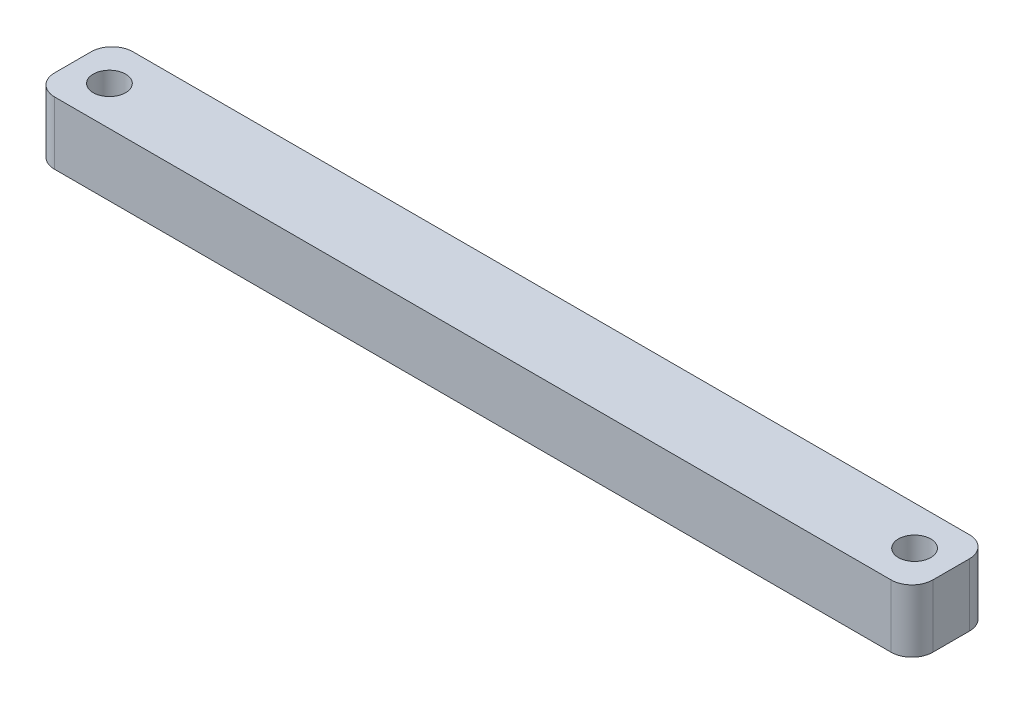
ISO-10303-21;
HEADER;
FILE_DESCRIPTION(('STEP AP214'),'2;1');
FILE_NAME('part.step','',(''),(''),'','','');
FILE_SCHEMA(('AUTOMOTIVE_DESIGN { 1 0 10303 214 1 1 1 1 }'));
ENDSEC;
DATA;
#1=APPLICATION_CONTEXT('core data for automotive mechanical design processes');
#2=APPLICATION_PROTOCOL_DEFINITION('international standard','automotive_design',2000,#1);
#3=PRODUCT_CONTEXT('',#1,'mechanical');
#4=PRODUCT('Part','Part','',(#3));
#5=PRODUCT_RELATED_PRODUCT_CATEGORY('part','',(#4));
#6=PRODUCT_DEFINITION_FORMATION('','',#4);
#7=PRODUCT_DEFINITION_CONTEXT('part definition',#1,'design');
#8=PRODUCT_DEFINITION('design','',#6,#7);
#9=PRODUCT_DEFINITION_SHAPE('','',#8);
#10=(LENGTH_UNIT() NAMED_UNIT(*) SI_UNIT(.MILLI.,.METRE.));
#11=(NAMED_UNIT(*) PLANE_ANGLE_UNIT() SI_UNIT($,.RADIAN.));
#12=(NAMED_UNIT(*) SI_UNIT($,.STERADIAN.) SOLID_ANGLE_UNIT());
#13=UNCERTAINTY_MEASURE_WITH_UNIT(LENGTH_MEASURE(1.E-05),#10,'distance_accuracy_value','');
#14=(GEOMETRIC_REPRESENTATION_CONTEXT(3) GLOBAL_UNCERTAINTY_ASSIGNED_CONTEXT((#13)) GLOBAL_UNIT_ASSIGNED_CONTEXT((#10,
#11,#12)) REPRESENTATION_CONTEXT('',''));
#15=CARTESIAN_POINT('',(0.,0.,0.));
#16=DIRECTION('',(0.,0.,1.));
#17=DIRECTION('',(1.,0.,0.));
#18=AXIS2_PLACEMENT_3D('',#15,#16,#17);
#19=CARTESIAN_POINT('',(0.,6.,0.));
#20=DIRECTION('',(0.,-1.,0.));
#21=DIRECTION('',(0.,0.,-1.));
#22=AXIS2_PLACEMENT_3D('',#19,#20,#21);
#23=PLANE('',#22);
#24=DIRECTION('',(0.,0.,-1.));
#25=VECTOR('',#24,1.);
#26=CARTESIAN_POINT('',(42.045,6.,3.75));
#27=LINE('',#26,#25);
#28=CARTESIAN_POINT('',(42.045,6.,1.75));
#29=VERTEX_POINT('',#28);
#30=CARTESIAN_POINT('',(42.045,6.,-1.75));
#31=VERTEX_POINT('',#30);
#32=EDGE_CURVE('E138',#29,#31,#27,.T.);
#33=ORIENTED_EDGE('',*,*,#32,.T.);
#34=CARTESIAN_POINT('',(40.045,6.,-1.75));
#35=DIRECTION('',(0.,-1.,0.));
#36=DIRECTION('',(0.,0.,-1.));
#37=AXIS2_PLACEMENT_3D('',#34,#35,#36);
#38=CIRCLE('',#37,2.);
#39=CARTESIAN_POINT('',(40.045,6.,-3.75));
#40=VERTEX_POINT('',#39);
#41=EDGE_CURVE('E152',#31,#40,#38,.F.);
#42=ORIENTED_EDGE('',*,*,#41,.T.);
#43=DIRECTION('',(-1.,0.,0.));
#44=VECTOR('',#43,1.);
#45=CARTESIAN_POINT('',(-42.045,6.,-3.75));
#46=LINE('',#45,#44);
#47=CARTESIAN_POINT('',(-40.045,6.,-3.75));
#48=VERTEX_POINT('',#47);
#49=EDGE_CURVE('E119',#40,#48,#46,.T.);
#50=ORIENTED_EDGE('',*,*,#49,.T.);
#51=CARTESIAN_POINT('',(-40.045,6.,-1.75));
#52=DIRECTION('',(0.,-1.,0.));
#53=DIRECTION('',(0.,0.,-1.));
#54=AXIS2_PLACEMENT_3D('',#51,#52,#53);
#55=CIRCLE('',#54,2.);
#56=CARTESIAN_POINT('',(-42.045,6.,-1.75));
#57=VERTEX_POINT('',#56);
#58=EDGE_CURVE('E148',#48,#57,#55,.F.);
#59=ORIENTED_EDGE('',*,*,#58,.T.);
#60=DIRECTION('',(0.,0.,1.));
#61=VECTOR('',#60,1.);
#62=CARTESIAN_POINT('',(-42.045,6.,3.75));
#63=LINE('',#62,#61);
#64=CARTESIAN_POINT('',(-42.045,6.,1.75));
#65=VERTEX_POINT('',#64);
#66=EDGE_CURVE('E161',#57,#65,#63,.T.);
#67=ORIENTED_EDGE('',*,*,#66,.T.);
#68=CARTESIAN_POINT('',(-40.045,6.,1.75));
#69=DIRECTION('',(0.,-1.,0.));
#70=DIRECTION('',(0.,0.,-1.));
#71=AXIS2_PLACEMENT_3D('',#68,#69,#70);
#72=CIRCLE('',#71,2.);
#73=CARTESIAN_POINT('',(-40.045,6.,3.75));
#74=VERTEX_POINT('',#73);
#75=EDGE_CURVE('E54',#65,#74,#72,.F.);
#76=ORIENTED_EDGE('',*,*,#75,.T.);
#77=DIRECTION('',(1.,0.,0.));
#78=VECTOR('',#77,1.);
#79=CARTESIAN_POINT('',(-42.045,6.,3.75));
#80=LINE('',#79,#78);
#81=CARTESIAN_POINT('',(40.045,6.,3.75));
#82=VERTEX_POINT('',#81);
#83=EDGE_CURVE('E139',#74,#82,#80,.T.);
#84=ORIENTED_EDGE('',*,*,#83,.T.);
#85=CARTESIAN_POINT('',(40.045,6.,1.75));
#86=DIRECTION('',(0.,-1.,0.));
#87=DIRECTION('',(0.,0.,-1.));
#88=AXIS2_PLACEMENT_3D('',#85,#86,#87);
#89=CIRCLE('',#88,2.);
#90=EDGE_CURVE('E150',#82,#29,#89,.F.);
#91=ORIENTED_EDGE('',*,*,#90,.T.);
#92=EDGE_LOOP('',(#33,#42,#50,#59,#67,#76,#84,#91));
#93=FACE_BOUND('',#92,.T.);
#94=CARTESIAN_POINT('',(-38.545,6.,0.));
#95=DIRECTION('',(0.,1.,0.));
#96=DIRECTION('',(0.,0.,1.));
#97=AXIS2_PLACEMENT_3D('',#94,#95,#96);
#98=CIRCLE('',#97,1.55);
#99=CARTESIAN_POINT('',(-38.545,6.,1.55));
#100=VERTEX_POINT('',#99);
#101=EDGE_CURVE('E133',#100,#100,#98,.T.);
#102=ORIENTED_EDGE('',*,*,#101,.F.);
#103=EDGE_LOOP('',(#102));
#104=FACE_BOUND('',#103,.T.);
#105=CARTESIAN_POINT('',(38.545,6.,0.));
#106=DIRECTION('',(0.,1.,0.));
#107=DIRECTION('',(0.,0.,-1.));
#108=AXIS2_PLACEMENT_3D('',#105,#106,#107);
#109=CIRCLE('',#108,1.55);
#110=CARTESIAN_POINT('',(38.545,6.,-1.55000000000001));
#111=VERTEX_POINT('',#110);
#112=EDGE_CURVE('E184',#111,#111,#109,.T.);
#113=ORIENTED_EDGE('',*,*,#112,.F.);
#114=EDGE_LOOP('',(#113));
#115=FACE_BOUND('',#114,.T.);
#116=ADVANCED_FACE('F32',(#93,#104,#115),#23,.F.);
#117=CARTESIAN_POINT('',(0.,0.,0.));
#118=DIRECTION('',(0.,-1.,0.));
#119=DIRECTION('',(0.,0.,-1.));
#120=AXIS2_PLACEMENT_3D('',#117,#118,#119);
#121=PLANE('',#120);
#122=CARTESIAN_POINT('',(-38.545,0.,0.));
#123=DIRECTION('',(0.,1.,0.));
#124=DIRECTION('',(0.,0.,1.));
#125=AXIS2_PLACEMENT_3D('',#122,#123,#124);
#126=CIRCLE('',#125,1.55);
#127=CARTESIAN_POINT('',(-38.545,0.,1.55));
#128=VERTEX_POINT('',#127);
#129=EDGE_CURVE('E181',#128,#128,#126,.T.);
#130=ORIENTED_EDGE('',*,*,#129,.T.);
#131=EDGE_LOOP('',(#130));
#132=FACE_BOUND('',#131,.T.);
#133=DIRECTION('',(-1.,0.,0.));
#134=VECTOR('',#133,1.);
#135=CARTESIAN_POINT('',(-42.045,0.,-3.75));
#136=LINE('',#135,#134);
#137=CARTESIAN_POINT('',(40.045,0.,-3.75));
#138=VERTEX_POINT('',#137);
#139=CARTESIAN_POINT('',(-40.045,0.,-3.75));
#140=VERTEX_POINT('',#139);
#141=EDGE_CURVE('E116',#138,#140,#136,.T.);
#142=ORIENTED_EDGE('',*,*,#141,.F.);
#143=CARTESIAN_POINT('',(40.045,0.,-1.75));
#144=DIRECTION('',(0.,-1.,0.));
#145=DIRECTION('',(0.,0.,-1.));
#146=AXIS2_PLACEMENT_3D('',#143,#144,#145);
#147=CIRCLE('',#146,2.);
#148=CARTESIAN_POINT('',(42.045,0.,-1.75));
#149=VERTEX_POINT('',#148);
#150=EDGE_CURVE('E99',#138,#149,#147,.T.);
#151=ORIENTED_EDGE('',*,*,#150,.T.);
#152=DIRECTION('',(0.,0.,-1.));
#153=VECTOR('',#152,1.);
#154=CARTESIAN_POINT('',(42.045,0.,3.75));
#155=LINE('',#154,#153);
#156=CARTESIAN_POINT('',(42.045,0.,1.75));
#157=VERTEX_POINT('',#156);
#158=EDGE_CURVE('E128',#157,#149,#155,.T.);
#159=ORIENTED_EDGE('',*,*,#158,.F.);
#160=CARTESIAN_POINT('',(40.045,0.,1.75));
#161=DIRECTION('',(0.,-1.,0.));
#162=DIRECTION('',(0.,0.,-1.));
#163=AXIS2_PLACEMENT_3D('',#160,#161,#162);
#164=CIRCLE('',#163,2.);
#165=CARTESIAN_POINT('',(40.045,0.,3.75));
#166=VERTEX_POINT('',#165);
#167=EDGE_CURVE('E110',#157,#166,#164,.T.);
#168=ORIENTED_EDGE('',*,*,#167,.T.);
#169=DIRECTION('',(1.,0.,0.));
#170=VECTOR('',#169,1.);
#171=CARTESIAN_POINT('',(-42.045,0.,3.75));
#172=LINE('',#171,#170);
#173=CARTESIAN_POINT('',(-40.045,0.,3.75));
#174=VERTEX_POINT('',#173);
#175=EDGE_CURVE('E131',#174,#166,#172,.T.);
#176=ORIENTED_EDGE('',*,*,#175,.F.);
#177=CARTESIAN_POINT('',(-40.045,0.,1.75));
#178=DIRECTION('',(0.,-1.,0.));
#179=DIRECTION('',(0.,0.,-1.));
#180=AXIS2_PLACEMENT_3D('',#177,#178,#179);
#181=CIRCLE('',#180,2.);
#182=CARTESIAN_POINT('',(-42.045,0.,1.75));
#183=VERTEX_POINT('',#182);
#184=EDGE_CURVE('E120',#174,#183,#181,.T.);
#185=ORIENTED_EDGE('',*,*,#184,.T.);
#186=DIRECTION('',(0.,0.,1.));
#187=VECTOR('',#186,1.);
#188=CARTESIAN_POINT('',(-42.045,0.,3.75));
#189=LINE('',#188,#187);
#190=CARTESIAN_POINT('',(-42.045,0.,-1.75));
#191=VERTEX_POINT('',#190);
#192=EDGE_CURVE('E127',#191,#183,#189,.T.);
#193=ORIENTED_EDGE('',*,*,#192,.F.);
#194=CARTESIAN_POINT('',(-40.045,0.,-1.75));
#195=DIRECTION('',(0.,-1.,0.));
#196=DIRECTION('',(0.,0.,-1.));
#197=AXIS2_PLACEMENT_3D('',#194,#195,#196);
#198=CIRCLE('',#197,2.);
#199=EDGE_CURVE('E126',#191,#140,#198,.T.);
#200=ORIENTED_EDGE('',*,*,#199,.T.);
#201=EDGE_LOOP('',(#142,#151,#159,#168,#176,#185,#193,#200));
#202=FACE_BOUND('',#201,.T.);
#203=CARTESIAN_POINT('',(38.545,0.,0.));
#204=DIRECTION('',(0.,1.,0.));
#205=DIRECTION('',(0.,0.,-1.));
#206=AXIS2_PLACEMENT_3D('',#203,#204,#205);
#207=CIRCLE('',#206,1.55);
#208=CARTESIAN_POINT('',(38.545,0.,-1.55000000000001));
#209=VERTEX_POINT('',#208);
#210=EDGE_CURVE('E187',#209,#209,#207,.T.);
#211=ORIENTED_EDGE('',*,*,#210,.T.);
#212=EDGE_LOOP('',(#211));
#213=FACE_BOUND('',#212,.T.);
#214=ADVANCED_FACE('F123',(#132,#202,#213),#121,.T.);
#215=CARTESIAN_POINT('',(42.045,6.,3.75));
#216=DIRECTION('',(-1.,0.,0.));
#217=DIRECTION('',(0.,0.,1.));
#218=AXIS2_PLACEMENT_3D('',#215,#216,#217);
#219=PLANE('',#218);
#220=ORIENTED_EDGE('',*,*,#158,.T.);
#221=DIRECTION('',(0.,-1.,0.));
#222=VECTOR('',#221,1.);
#223=CARTESIAN_POINT('',(42.045,6.,-1.75));
#224=LINE('',#223,#222);
#225=EDGE_CURVE('E104',#149,#31,#224,.F.);
#226=ORIENTED_EDGE('',*,*,#225,.T.);
#227=ORIENTED_EDGE('',*,*,#32,.F.);
#228=DIRECTION('',(0.,-1.,0.));
#229=VECTOR('',#228,1.);
#230=CARTESIAN_POINT('',(42.045,6.,1.75));
#231=LINE('',#230,#229);
#232=EDGE_CURVE('E109',#29,#157,#231,.T.);
#233=ORIENTED_EDGE('',*,*,#232,.T.);
#234=EDGE_LOOP('',(#220,#226,#227,#233));
#235=FACE_BOUND('',#234,.T.);
#236=ADVANCED_FACE('F177',(#235),#219,.F.);
#237=CARTESIAN_POINT('',(-42.045,6.,-3.75));
#238=DIRECTION('',(0.,0.,1.));
#239=DIRECTION('',(1.,0.,0.));
#240=AXIS2_PLACEMENT_3D('',#237,#238,#239);
#241=PLANE('',#240);
#242=ORIENTED_EDGE('',*,*,#49,.F.);
#243=DIRECTION('',(0.,-1.,0.));
#244=VECTOR('',#243,1.);
#245=CARTESIAN_POINT('',(40.045,6.,-3.75));
#246=LINE('',#245,#244);
#247=EDGE_CURVE('E103',#40,#138,#246,.T.);
#248=ORIENTED_EDGE('',*,*,#247,.T.);
#249=ORIENTED_EDGE('',*,*,#141,.T.);
#250=DIRECTION('',(0.,-1.,0.));
#251=VECTOR('',#250,1.);
#252=CARTESIAN_POINT('',(-40.045,6.,-3.75));
#253=LINE('',#252,#251);
#254=EDGE_CURVE('E121',#140,#48,#253,.F.);
#255=ORIENTED_EDGE('',*,*,#254,.T.);
#256=EDGE_LOOP('',(#242,#248,#249,#255));
#257=FACE_BOUND('',#256,.T.);
#258=ADVANCED_FACE('F115',(#257),#241,.F.);
#259=CARTESIAN_POINT('',(-42.045,6.,3.75));
#260=DIRECTION('',(1.,0.,0.));
#261=DIRECTION('',(0.,0.,-1.));
#262=AXIS2_PLACEMENT_3D('',#259,#260,#261);
#263=PLANE('',#262);
#264=ORIENTED_EDGE('',*,*,#66,.F.);
#265=DIRECTION('',(0.,-1.,0.));
#266=VECTOR('',#265,1.);
#267=CARTESIAN_POINT('',(-42.045,6.,-1.75));
#268=LINE('',#267,#266);
#269=EDGE_CURVE('E11',#57,#191,#268,.T.);
#270=ORIENTED_EDGE('',*,*,#269,.T.);
#271=ORIENTED_EDGE('',*,*,#192,.T.);
#272=DIRECTION('',(0.,-1.,0.));
#273=VECTOR('',#272,1.);
#274=CARTESIAN_POINT('',(-42.045,6.,1.75));
#275=LINE('',#274,#273);
#276=EDGE_CURVE('E40',#183,#65,#275,.F.);
#277=ORIENTED_EDGE('',*,*,#276,.T.);
#278=EDGE_LOOP('',(#264,#270,#271,#277));
#279=FACE_BOUND('',#278,.T.);
#280=ADVANCED_FACE('F160',(#279),#263,.F.);
#281=CARTESIAN_POINT('',(-42.045,6.,3.75));
#282=DIRECTION('',(0.,0.,-1.));
#283=DIRECTION('',(-1.,0.,0.));
#284=AXIS2_PLACEMENT_3D('',#281,#282,#283);
#285=PLANE('',#284);
#286=ORIENTED_EDGE('',*,*,#175,.T.);
#287=DIRECTION('',(0.,-1.,0.));
#288=VECTOR('',#287,1.);
#289=CARTESIAN_POINT('',(40.045,6.,3.75));
#290=LINE('',#289,#288);
#291=EDGE_CURVE('E47',#166,#82,#290,.F.);
#292=ORIENTED_EDGE('',*,*,#291,.T.);
#293=ORIENTED_EDGE('',*,*,#83,.F.);
#294=DIRECTION('',(0.,-1.,0.));
#295=VECTOR('',#294,1.);
#296=CARTESIAN_POINT('',(-40.045,6.,3.75));
#297=LINE('',#296,#295);
#298=EDGE_CURVE('E154',#74,#174,#297,.T.);
#299=ORIENTED_EDGE('',*,*,#298,.T.);
#300=EDGE_LOOP('',(#286,#292,#293,#299));
#301=FACE_BOUND('',#300,.T.);
#302=ADVANCED_FACE('F170',(#301),#285,.F.);
#303=CARTESIAN_POINT('',(-38.545,6.,0.));
#304=DIRECTION('',(0.,-1.,0.));
#305=DIRECTION('',(0.,0.,-1.));
#306=AXIS2_PLACEMENT_3D('',#303,#304,#305);
#307=CYLINDRICAL_SURFACE('',#306,1.55);
#308=ORIENTED_EDGE('',*,*,#101,.T.);
#309=EDGE_LOOP('',(#308));
#310=FACE_BOUND('',#309,.T.);
#311=ORIENTED_EDGE('',*,*,#129,.F.);
#312=EDGE_LOOP('',(#311));
#313=FACE_BOUND('',#312,.T.);
#314=ADVANCED_FACE('F204',(#310,#313),#307,.F.);
#315=CARTESIAN_POINT('',(38.545,6.,0.));
#316=DIRECTION('',(0.,-1.,0.));
#317=DIRECTION('',(0.,0.,-1.));
#318=AXIS2_PLACEMENT_3D('',#315,#316,#317);
#319=CYLINDRICAL_SURFACE('',#318,1.55);
#320=ORIENTED_EDGE('',*,*,#112,.T.);
#321=EDGE_LOOP('',(#320));
#322=FACE_BOUND('',#321,.T.);
#323=ORIENTED_EDGE('',*,*,#210,.F.);
#324=EDGE_LOOP('',(#323));
#325=FACE_BOUND('',#324,.T.);
#326=ADVANCED_FACE('F193',(#322,#325),#319,.F.);
#327=CARTESIAN_POINT('',(40.045,6.,-1.75));
#328=DIRECTION('',(0.,-1.,0.));
#329=DIRECTION('',(0.,0.,-1.));
#330=AXIS2_PLACEMENT_3D('',#327,#328,#329);
#331=CYLINDRICAL_SURFACE('',#330,2.);
#332=ORIENTED_EDGE('',*,*,#41,.F.);
#333=ORIENTED_EDGE('',*,*,#225,.F.);
#334=ORIENTED_EDGE('',*,*,#150,.F.);
#335=ORIENTED_EDGE('',*,*,#247,.F.);
#336=EDGE_LOOP('',(#332,#333,#334,#335));
#337=FACE_BOUND('',#336,.T.);
#338=ADVANCED_FACE('F102',(#337),#331,.T.);
#339=CARTESIAN_POINT('',(40.045,6.,1.75));
#340=DIRECTION('',(0.,-1.,0.));
#341=DIRECTION('',(0.,0.,-1.));
#342=AXIS2_PLACEMENT_3D('',#339,#340,#341);
#343=CYLINDRICAL_SURFACE('',#342,2.);
#344=ORIENTED_EDGE('',*,*,#90,.F.);
#345=ORIENTED_EDGE('',*,*,#291,.F.);
#346=ORIENTED_EDGE('',*,*,#167,.F.);
#347=ORIENTED_EDGE('',*,*,#232,.F.);
#348=EDGE_LOOP('',(#344,#345,#346,#347));
#349=FACE_BOUND('',#348,.T.);
#350=ADVANCED_FACE('F174',(#349),#343,.T.);
#351=CARTESIAN_POINT('',(-40.045,6.,-1.75));
#352=DIRECTION('',(0.,-1.,0.));
#353=DIRECTION('',(0.,0.,-1.));
#354=AXIS2_PLACEMENT_3D('',#351,#352,#353);
#355=CYLINDRICAL_SURFACE('',#354,2.);
#356=ORIENTED_EDGE('',*,*,#58,.F.);
#357=ORIENTED_EDGE('',*,*,#254,.F.);
#358=ORIENTED_EDGE('',*,*,#199,.F.);
#359=ORIENTED_EDGE('',*,*,#269,.F.);
#360=EDGE_LOOP('',(#356,#357,#358,#359));
#361=FACE_BOUND('',#360,.T.);
#362=ADVANCED_FACE('F218',(#361),#355,.T.);
#363=CARTESIAN_POINT('',(-40.045,6.,1.75));
#364=DIRECTION('',(0.,-1.,0.));
#365=DIRECTION('',(0.,0.,-1.));
#366=AXIS2_PLACEMENT_3D('',#363,#364,#365);
#367=CYLINDRICAL_SURFACE('',#366,2.);
#368=ORIENTED_EDGE('',*,*,#75,.F.);
#369=ORIENTED_EDGE('',*,*,#276,.F.);
#370=ORIENTED_EDGE('',*,*,#184,.F.);
#371=ORIENTED_EDGE('',*,*,#298,.F.);
#372=EDGE_LOOP('',(#368,#369,#370,#371));
#373=FACE_BOUND('',#372,.T.);
#374=ADVANCED_FACE('F34',(#373),#367,.T.);
#375=CLOSED_SHELL('',(#116,#214,#236,#258,#280,#302,#314,#326,#338,#350,#362,#374));
#376=MANIFOLD_SOLID_BREP('B2',#375);
#377=ADVANCED_BREP_SHAPE_REPRESENTATION('',(#18,#376),#14);
#378=SHAPE_DEFINITION_REPRESENTATION(#9,#377);
ENDSEC;
END-ISO-10303-21;
